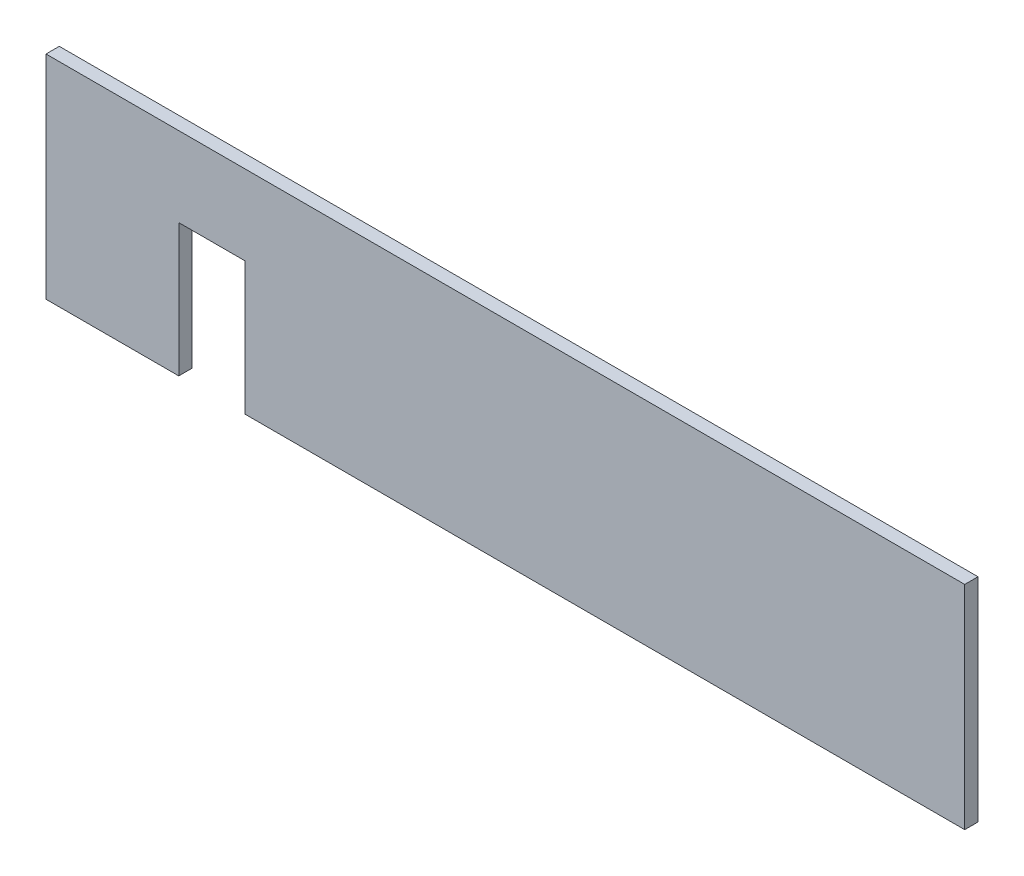
ISO-10303-21;
HEADER;
FILE_DESCRIPTION(('STEP AP214'),'2;1');
FILE_NAME('part.step','',(''),(''),'','','');
FILE_SCHEMA(('AUTOMOTIVE_DESIGN { 1 0 10303 214 1 1 1 1 }'));
ENDSEC;
DATA;
#1=APPLICATION_CONTEXT('core data for automotive mechanical design processes');
#2=APPLICATION_PROTOCOL_DEFINITION('international standard','automotive_design',2000,#1);
#3=PRODUCT_CONTEXT('',#1,'mechanical');
#4=PRODUCT('Part','Part','',(#3));
#5=PRODUCT_RELATED_PRODUCT_CATEGORY('part','',(#4));
#6=PRODUCT_DEFINITION_FORMATION('','',#4);
#7=PRODUCT_DEFINITION_CONTEXT('part definition',#1,'design');
#8=PRODUCT_DEFINITION('design','',#6,#7);
#9=PRODUCT_DEFINITION_SHAPE('','',#8);
#10=(LENGTH_UNIT() NAMED_UNIT(*) SI_UNIT(.MILLI.,.METRE.));
#11=(NAMED_UNIT(*) PLANE_ANGLE_UNIT() SI_UNIT($,.RADIAN.));
#12=(NAMED_UNIT(*) SI_UNIT($,.STERADIAN.) SOLID_ANGLE_UNIT());
#13=UNCERTAINTY_MEASURE_WITH_UNIT(LENGTH_MEASURE(1.E-05),#10,'distance_accuracy_value','');
#14=(GEOMETRIC_REPRESENTATION_CONTEXT(3) GLOBAL_UNCERTAINTY_ASSIGNED_CONTEXT((#13)) GLOBAL_UNIT_ASSIGNED_CONTEXT((#10,
#11,#12)) REPRESENTATION_CONTEXT('',''));
#15=CARTESIAN_POINT('',(0.,0.,0.));
#16=DIRECTION('',(0.,0.,1.));
#17=DIRECTION('',(1.,0.,0.));
#18=AXIS2_PLACEMENT_3D('',#15,#16,#17);
#19=CARTESIAN_POINT('',(-172.085,0.,3.175));
#20=DIRECTION('',(0.,1.,0.));
#21=DIRECTION('',(0.,0.,1.));
#22=AXIS2_PLACEMENT_3D('',#19,#20,#21);
#23=PLANE('',#22);
#24=DIRECTION('',(1.,0.,0.));
#25=VECTOR('',#24,1.);
#26=CARTESIAN_POINT('',(-172.085,0.,0.));
#27=LINE('',#26,#25);
#28=CARTESIAN_POINT('',(-172.085,0.,0.));
#29=VERTEX_POINT('',#28);
#30=CARTESIAN_POINT('',(0.,0.,0.));
#31=VERTEX_POINT('',#30);
#32=EDGE_CURVE('E134',#29,#31,#27,.T.);
#33=ORIENTED_EDGE('',*,*,#32,.T.);
#34=DIRECTION('',(0.,0.,-1.));
#35=VECTOR('',#34,1.);
#36=CARTESIAN_POINT('',(0.,0.,3.175));
#37=LINE('',#36,#35);
#38=CARTESIAN_POINT('',(0.,0.,3.175));
#39=VERTEX_POINT('',#38);
#40=EDGE_CURVE('E11',#39,#31,#37,.T.);
#41=ORIENTED_EDGE('',*,*,#40,.F.);
#42=DIRECTION('',(1.,0.,0.));
#43=VECTOR('',#42,1.);
#44=CARTESIAN_POINT('',(-172.085,0.,3.175));
#45=LINE('',#44,#43);
#46=CARTESIAN_POINT('',(-172.085,0.,3.175));
#47=VERTEX_POINT('',#46);
#48=EDGE_CURVE('E148',#47,#39,#45,.T.);
#49=ORIENTED_EDGE('',*,*,#48,.F.);
#50=DIRECTION('',(0.,0.,-1.));
#51=VECTOR('',#50,1.);
#52=CARTESIAN_POINT('',(-172.085,0.,3.175));
#53=LINE('',#52,#51);
#54=EDGE_CURVE('E130',#47,#29,#53,.T.);
#55=ORIENTED_EDGE('',*,*,#54,.T.);
#56=EDGE_LOOP('',(#33,#41,#49,#55));
#57=FACE_BOUND('',#56,.T.);
#58=ADVANCED_FACE('F38',(#57),#23,.F.);
#59=CARTESIAN_POINT('',(0.,0.,3.175));
#60=DIRECTION('',(-1.,0.,0.));
#61=DIRECTION('',(0.,0.,1.));
#62=AXIS2_PLACEMENT_3D('',#59,#60,#61);
#63=PLANE('',#62);
#64=DIRECTION('',(0.,1.,0.));
#65=VECTOR('',#64,1.);
#66=CARTESIAN_POINT('',(0.,0.,0.));
#67=LINE('',#66,#65);
#68=CARTESIAN_POINT('',(0.,50.8,0.));
#69=VERTEX_POINT('',#68);
#70=EDGE_CURVE('E137',#31,#69,#67,.T.);
#71=ORIENTED_EDGE('',*,*,#70,.T.);
#72=DIRECTION('',(0.,0.,-1.));
#73=VECTOR('',#72,1.);
#74=CARTESIAN_POINT('',(0.,50.8,3.175));
#75=LINE('',#74,#73);
#76=CARTESIAN_POINT('',(0.,50.8,3.175));
#77=VERTEX_POINT('',#76);
#78=EDGE_CURVE('E46',#77,#69,#75,.T.);
#79=ORIENTED_EDGE('',*,*,#78,.F.);
#80=DIRECTION('',(0.,1.,0.));
#81=VECTOR('',#80,1.);
#82=CARTESIAN_POINT('',(0.,0.,3.175));
#83=LINE('',#82,#81);
#84=EDGE_CURVE('E97',#39,#77,#83,.T.);
#85=ORIENTED_EDGE('',*,*,#84,.F.);
#86=ORIENTED_EDGE('',*,*,#40,.T.);
#87=EDGE_LOOP('',(#71,#79,#85,#86));
#88=FACE_BOUND('',#87,.T.);
#89=ADVANCED_FACE('F183',(#88),#63,.F.);
#90=CARTESIAN_POINT('',(0.,50.8,3.175));
#91=DIRECTION('',(0.,-1.,0.));
#92=DIRECTION('',(1.,0.,0.));
#93=AXIS2_PLACEMENT_3D('',#90,#91,#92);
#94=PLANE('',#93);
#95=DIRECTION('',(-1.,0.,0.));
#96=VECTOR('',#95,1.);
#97=CARTESIAN_POINT('',(0.,50.8,0.));
#98=LINE('',#97,#96);
#99=CARTESIAN_POINT('',(-219.71,50.8,0.));
#100=VERTEX_POINT('',#99);
#101=EDGE_CURVE('E139',#69,#100,#98,.T.);
#102=ORIENTED_EDGE('',*,*,#101,.T.);
#103=DIRECTION('',(0.,0.,-1.));
#104=VECTOR('',#103,1.);
#105=CARTESIAN_POINT('',(-219.71,50.8,3.175));
#106=LINE('',#105,#104);
#107=CARTESIAN_POINT('',(-219.71,50.8,3.175));
#108=VERTEX_POINT('',#107);
#109=EDGE_CURVE('E155',#108,#100,#106,.T.);
#110=ORIENTED_EDGE('',*,*,#109,.F.);
#111=DIRECTION('',(-1.,0.,0.));
#112=VECTOR('',#111,1.);
#113=CARTESIAN_POINT('',(0.,50.8,3.175));
#114=LINE('',#113,#112);
#115=EDGE_CURVE('E163',#77,#108,#114,.T.);
#116=ORIENTED_EDGE('',*,*,#115,.F.);
#117=ORIENTED_EDGE('',*,*,#78,.T.);
#118=EDGE_LOOP('',(#102,#110,#116,#117));
#119=FACE_BOUND('',#118,.T.);
#120=ADVANCED_FACE('F161',(#119),#94,.F.);
#121=CARTESIAN_POINT('',(-219.71,50.8,3.175));
#122=DIRECTION('',(1.,0.,0.));
#123=DIRECTION('',(0.,0.,-1.));
#124=AXIS2_PLACEMENT_3D('',#121,#122,#123);
#125=PLANE('',#124);
#126=DIRECTION('',(0.,-1.,0.));
#127=VECTOR('',#126,1.);
#128=CARTESIAN_POINT('',(-219.71,50.8,0.));
#129=LINE('',#128,#127);
#130=CARTESIAN_POINT('',(-219.71,0.,0.));
#131=VERTEX_POINT('',#130);
#132=EDGE_CURVE('E141',#100,#131,#129,.T.);
#133=ORIENTED_EDGE('',*,*,#132,.T.);
#134=DIRECTION('',(0.,0.,-1.));
#135=VECTOR('',#134,1.);
#136=CARTESIAN_POINT('',(-219.71,0.,3.175));
#137=LINE('',#136,#135);
#138=CARTESIAN_POINT('',(-219.71,0.,3.175));
#139=VERTEX_POINT('',#138);
#140=EDGE_CURVE('E152',#139,#131,#137,.T.);
#141=ORIENTED_EDGE('',*,*,#140,.F.);
#142=DIRECTION('',(0.,-1.,0.));
#143=VECTOR('',#142,1.);
#144=CARTESIAN_POINT('',(-219.71,50.8,3.175));
#145=LINE('',#144,#143);
#146=EDGE_CURVE('E175',#108,#139,#145,.T.);
#147=ORIENTED_EDGE('',*,*,#146,.F.);
#148=ORIENTED_EDGE('',*,*,#109,.T.);
#149=EDGE_LOOP('',(#133,#141,#147,#148));
#150=FACE_BOUND('',#149,.T.);
#151=ADVANCED_FACE('F171',(#150),#125,.F.);
#152=CARTESIAN_POINT('',(-219.71,0.,3.175));
#153=DIRECTION('',(0.,1.,0.));
#154=DIRECTION('',(0.,0.,1.));
#155=AXIS2_PLACEMENT_3D('',#152,#153,#154);
#156=PLANE('',#155);
#157=DIRECTION('',(1.,0.,0.));
#158=VECTOR('',#157,1.);
#159=CARTESIAN_POINT('',(-219.71,0.,0.));
#160=LINE('',#159,#158);
#161=CARTESIAN_POINT('',(-187.96,0.,0.));
#162=VERTEX_POINT('',#161);
#163=EDGE_CURVE('E143',#131,#162,#160,.T.);
#164=ORIENTED_EDGE('',*,*,#163,.T.);
#165=DIRECTION('',(0.,0.,-1.));
#166=VECTOR('',#165,1.);
#167=CARTESIAN_POINT('',(-187.96,0.,3.175));
#168=LINE('',#167,#166);
#169=CARTESIAN_POINT('',(-187.96,0.,3.175));
#170=VERTEX_POINT('',#169);
#171=EDGE_CURVE('E125',#170,#162,#168,.T.);
#172=ORIENTED_EDGE('',*,*,#171,.F.);
#173=DIRECTION('',(1.,0.,0.));
#174=VECTOR('',#173,1.);
#175=CARTESIAN_POINT('',(-219.71,0.,3.175));
#176=LINE('',#175,#174);
#177=EDGE_CURVE('E116',#139,#170,#176,.T.);
#178=ORIENTED_EDGE('',*,*,#177,.F.);
#179=ORIENTED_EDGE('',*,*,#140,.T.);
#180=EDGE_LOOP('',(#164,#172,#178,#179));
#181=FACE_BOUND('',#180,.T.);
#182=ADVANCED_FACE('F174',(#181),#156,.F.);
#183=CARTESIAN_POINT('',(-187.96,0.,3.175));
#184=DIRECTION('',(-1.,0.,0.));
#185=DIRECTION('',(0.,0.,1.));
#186=AXIS2_PLACEMENT_3D('',#183,#184,#185);
#187=PLANE('',#186);
#188=DIRECTION('',(0.,1.,0.));
#189=VECTOR('',#188,1.);
#190=CARTESIAN_POINT('',(-187.96,0.,0.));
#191=LINE('',#190,#189);
#192=CARTESIAN_POINT('',(-187.96,31.75,0.));
#193=VERTEX_POINT('',#192);
#194=EDGE_CURVE('E124',#162,#193,#191,.T.);
#195=ORIENTED_EDGE('',*,*,#194,.T.);
#196=DIRECTION('',(0.,0.,-1.));
#197=VECTOR('',#196,1.);
#198=CARTESIAN_POINT('',(-187.96,31.75,3.175));
#199=LINE('',#198,#197);
#200=CARTESIAN_POINT('',(-187.96,31.75,3.175));
#201=VERTEX_POINT('',#200);
#202=EDGE_CURVE('E121',#201,#193,#199,.T.);
#203=ORIENTED_EDGE('',*,*,#202,.F.);
#204=DIRECTION('',(0.,1.,0.));
#205=VECTOR('',#204,1.);
#206=CARTESIAN_POINT('',(-187.96,0.,3.175));
#207=LINE('',#206,#205);
#208=EDGE_CURVE('E110',#170,#201,#207,.T.);
#209=ORIENTED_EDGE('',*,*,#208,.F.);
#210=ORIENTED_EDGE('',*,*,#171,.T.);
#211=EDGE_LOOP('',(#195,#203,#209,#210));
#212=FACE_BOUND('',#211,.T.);
#213=ADVANCED_FACE('F122',(#212),#187,.F.);
#214=CARTESIAN_POINT('',(-187.96,31.75,3.175));
#215=DIRECTION('',(0.,1.,0.));
#216=DIRECTION('',(0.,0.,1.));
#217=AXIS2_PLACEMENT_3D('',#214,#215,#216);
#218=PLANE('',#217);
#219=DIRECTION('',(1.,0.,0.));
#220=VECTOR('',#219,1.);
#221=CARTESIAN_POINT('',(-187.96,31.75,0.));
#222=LINE('',#221,#220);
#223=CARTESIAN_POINT('',(-172.085,31.75,0.));
#224=VERTEX_POINT('',#223);
#225=EDGE_CURVE('E83',#193,#224,#222,.T.);
#226=ORIENTED_EDGE('',*,*,#225,.T.);
#227=DIRECTION('',(0.,0.,-1.));
#228=VECTOR('',#227,1.);
#229=CARTESIAN_POINT('',(-172.085,31.75,3.175));
#230=LINE('',#229,#228);
#231=CARTESIAN_POINT('',(-172.085,31.75,3.175));
#232=VERTEX_POINT('',#231);
#233=EDGE_CURVE('E126',#232,#224,#230,.T.);
#234=ORIENTED_EDGE('',*,*,#233,.F.);
#235=DIRECTION('',(1.,0.,0.));
#236=VECTOR('',#235,1.);
#237=CARTESIAN_POINT('',(-187.96,31.75,3.175));
#238=LINE('',#237,#236);
#239=EDGE_CURVE('E114',#201,#232,#238,.T.);
#240=ORIENTED_EDGE('',*,*,#239,.F.);
#241=ORIENTED_EDGE('',*,*,#202,.T.);
#242=EDGE_LOOP('',(#226,#234,#240,#241));
#243=FACE_BOUND('',#242,.T.);
#244=ADVANCED_FACE('F128',(#243),#218,.F.);
#245=CARTESIAN_POINT('',(-172.085,31.75,3.175));
#246=DIRECTION('',(1.,0.,0.));
#247=DIRECTION('',(0.,0.,-1.));
#248=AXIS2_PLACEMENT_3D('',#245,#246,#247);
#249=PLANE('',#248);
#250=DIRECTION('',(0.,-1.,0.));
#251=VECTOR('',#250,1.);
#252=CARTESIAN_POINT('',(-172.085,31.75,0.));
#253=LINE('',#252,#251);
#254=EDGE_CURVE('E89',#224,#29,#253,.T.);
#255=ORIENTED_EDGE('',*,*,#254,.T.);
#256=ORIENTED_EDGE('',*,*,#54,.F.);
#257=DIRECTION('',(0.,-1.,0.));
#258=VECTOR('',#257,1.);
#259=CARTESIAN_POINT('',(-172.085,31.75,3.175));
#260=LINE('',#259,#258);
#261=EDGE_CURVE('E54',#232,#47,#260,.T.);
#262=ORIENTED_EDGE('',*,*,#261,.F.);
#263=ORIENTED_EDGE('',*,*,#233,.T.);
#264=EDGE_LOOP('',(#255,#256,#262,#263));
#265=FACE_BOUND('',#264,.T.);
#266=ADVANCED_FACE('F199',(#265),#249,.F.);
#267=CARTESIAN_POINT('',(0.,0.,3.175));
#268=DIRECTION('',(0.,0.,1.));
#269=DIRECTION('',(1.,0.,0.));
#270=AXIS2_PLACEMENT_3D('',#267,#268,#269);
#271=PLANE('',#270);
#272=ORIENTED_EDGE('',*,*,#48,.T.);
#273=ORIENTED_EDGE('',*,*,#84,.T.);
#274=ORIENTED_EDGE('',*,*,#115,.T.);
#275=ORIENTED_EDGE('',*,*,#146,.T.);
#276=ORIENTED_EDGE('',*,*,#177,.T.);
#277=ORIENTED_EDGE('',*,*,#208,.T.);
#278=ORIENTED_EDGE('',*,*,#239,.T.);
#279=ORIENTED_EDGE('',*,*,#261,.T.);
#280=EDGE_LOOP('',(#272,#273,#274,#275,#276,#277,#278,#279));
#281=FACE_BOUND('',#280,.T.);
#282=ADVANCED_FACE('F112',(#281),#271,.T.);
#283=CARTESIAN_POINT('',(0.,0.,0.));
#284=DIRECTION('',(0.,0.,1.));
#285=DIRECTION('',(1.,0.,0.));
#286=AXIS2_PLACEMENT_3D('',#283,#284,#285);
#287=PLANE('',#286);
#288=ORIENTED_EDGE('',*,*,#32,.F.);
#289=ORIENTED_EDGE('',*,*,#254,.F.);
#290=ORIENTED_EDGE('',*,*,#225,.F.);
#291=ORIENTED_EDGE('',*,*,#194,.F.);
#292=ORIENTED_EDGE('',*,*,#163,.F.);
#293=ORIENTED_EDGE('',*,*,#132,.F.);
#294=ORIENTED_EDGE('',*,*,#101,.F.);
#295=ORIENTED_EDGE('',*,*,#70,.F.);
#296=EDGE_LOOP('',(#288,#289,#290,#291,#292,#293,#294,#295));
#297=FACE_BOUND('',#296,.T.);
#298=ADVANCED_FACE('F167',(#297),#287,.F.);
#299=CLOSED_SHELL('',(#58,#89,#120,#151,#182,#213,#244,#266,#282,#298));
#300=MANIFOLD_SOLID_BREP('B2',#299);
#301=ADVANCED_BREP_SHAPE_REPRESENTATION('',(#18,#300),#14);
#302=SHAPE_DEFINITION_REPRESENTATION(#9,#301);
ENDSEC;
END-ISO-10303-21;
